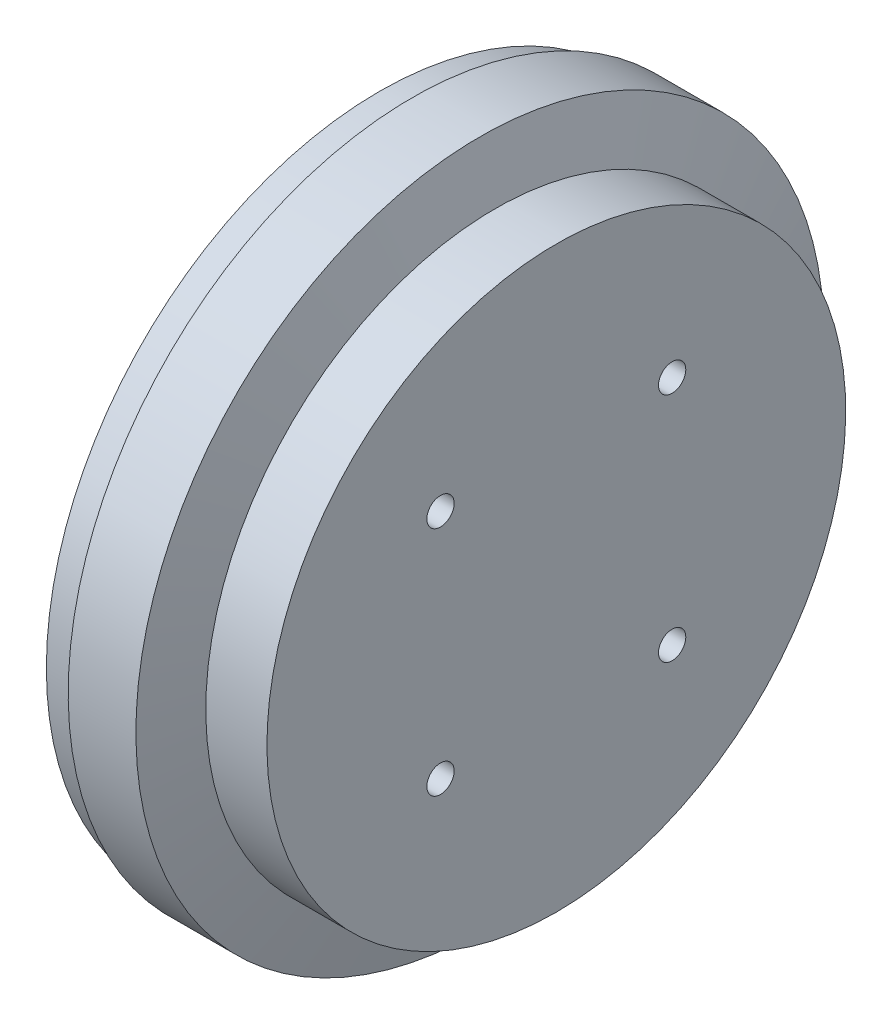
ISO-10303-21;
HEADER;
FILE_DESCRIPTION(('STEP AP214'),'2;1');
FILE_NAME('part.step','',(''),(''),'','','');
FILE_SCHEMA(('AUTOMOTIVE_DESIGN { 1 0 10303 214 1 1 1 1 }'));
ENDSEC;
DATA;
#1=APPLICATION_CONTEXT('core data for automotive mechanical design processes');
#2=APPLICATION_PROTOCOL_DEFINITION('international standard','automotive_design',2000,#1);
#3=PRODUCT_CONTEXT('',#1,'mechanical');
#4=PRODUCT('Part','Part','',(#3));
#5=PRODUCT_RELATED_PRODUCT_CATEGORY('part','',(#4));
#6=PRODUCT_DEFINITION_FORMATION('','',#4);
#7=PRODUCT_DEFINITION_CONTEXT('part definition',#1,'design');
#8=PRODUCT_DEFINITION('design','',#6,#7);
#9=PRODUCT_DEFINITION_SHAPE('','',#8);
#10=(LENGTH_UNIT() NAMED_UNIT(*) SI_UNIT(.MILLI.,.METRE.));
#11=(NAMED_UNIT(*) PLANE_ANGLE_UNIT() SI_UNIT($,.RADIAN.));
#12=(NAMED_UNIT(*) SI_UNIT($,.STERADIAN.) SOLID_ANGLE_UNIT());
#13=UNCERTAINTY_MEASURE_WITH_UNIT(LENGTH_MEASURE(1.E-05),#10,'distance_accuracy_value','');
#14=(GEOMETRIC_REPRESENTATION_CONTEXT(3) GLOBAL_UNCERTAINTY_ASSIGNED_CONTEXT((#13)) GLOBAL_UNIT_ASSIGNED_CONTEXT((#10,
#11,#12)) REPRESENTATION_CONTEXT('',''));
#15=CARTESIAN_POINT('',(0.,0.,0.));
#16=DIRECTION('',(0.,0.,1.));
#17=DIRECTION('',(1.,0.,0.));
#18=AXIS2_PLACEMENT_3D('',#15,#16,#17);
#19=CARTESIAN_POINT('',(-6.59999999999999,0.,0.));
#20=DIRECTION('',(-1.,0.,0.));
#21=DIRECTION('',(0.,-1.,0.));
#22=AXIS2_PLACEMENT_3D('',#19,#20,#21);
#23=CYLINDRICAL_SURFACE('',#22,26.5);
#24=CARTESIAN_POINT('',(1.,0.,0.));
#25=DIRECTION('',(-1.,0.,0.));
#26=DIRECTION('',(0.,-1.,0.));
#27=AXIS2_PLACEMENT_3D('',#24,#25,#26);
#28=CIRCLE('',#27,26.5);
#29=CARTESIAN_POINT('',(1.,-26.5,0.));
#30=VERTEX_POINT('',#29);
#31=EDGE_CURVE('E39',#30,#30,#28,.T.);
#32=ORIENTED_EDGE('',*,*,#31,.F.);
#33=EDGE_LOOP('',(#32));
#34=FACE_BOUND('',#33,.T.);
#35=CARTESIAN_POINT('',(6.59999999999999,0.,0.));
#36=DIRECTION('',(-1.,0.,0.));
#37=DIRECTION('',(0.,-1.,0.));
#38=AXIS2_PLACEMENT_3D('',#35,#36,#37);
#39=CIRCLE('',#38,26.5);
#40=CARTESIAN_POINT('',(6.59999999999999,-26.5,0.));
#41=VERTEX_POINT('',#40);
#42=EDGE_CURVE('E91',#41,#41,#39,.T.);
#43=ORIENTED_EDGE('',*,*,#42,.T.);
#44=EDGE_LOOP('',(#43));
#45=FACE_BOUND('',#44,.T.);
#46=ADVANCED_FACE('F36',(#34,#45),#23,.T.);
#47=CARTESIAN_POINT('',(1.,0.,0.));
#48=DIRECTION('',(-1.,0.,0.));
#49=DIRECTION('',(0.,-1.,0.));
#50=AXIS2_PLACEMENT_3D('',#47,#48,#49);
#51=CONICAL_SURFACE('',#50,26.5,1.29778762370819);
#52=CARTESIAN_POINT('',(-0.399999999999991,0.,0.));
#53=DIRECTION('',(-1.,0.,0.));
#54=DIRECTION('',(0.,-1.,0.));
#55=AXIS2_PLACEMENT_3D('',#52,#53,#54);
#56=CIRCLE('',#55,31.5);
#57=CARTESIAN_POINT('',(-0.399999999999991,-31.5,0.));
#58=VERTEX_POINT('',#57);
#59=EDGE_CURVE('E96',#58,#58,#56,.T.);
#60=ORIENTED_EDGE('',*,*,#59,.F.);
#61=EDGE_LOOP('',(#60));
#62=FACE_BOUND('',#61,.T.);
#63=ORIENTED_EDGE('',*,*,#31,.T.);
#64=EDGE_LOOP('',(#63));
#65=FACE_BOUND('',#64,.T.);
#66=ADVANCED_FACE('F103',(#62,#65),#51,.T.);
#67=CARTESIAN_POINT('',(-6.59999999999999,0.,0.));
#68=DIRECTION('',(-1.,0.,0.));
#69=DIRECTION('',(0.,-1.,0.));
#70=AXIS2_PLACEMENT_3D('',#67,#68,#69);
#71=CYLINDRICAL_SURFACE('',#70,31.5);
#72=CARTESIAN_POINT('',(-6.59999999999999,0.,0.));
#73=DIRECTION('',(-1.,0.,0.));
#74=DIRECTION('',(0.,-1.,0.));
#75=AXIS2_PLACEMENT_3D('',#72,#73,#74);
#76=CIRCLE('',#75,31.5);
#77=CARTESIAN_POINT('',(-6.59999999999999,-31.5,0.));
#78=VERTEX_POINT('',#77);
#79=EDGE_CURVE('E94',#78,#78,#76,.T.);
#80=ORIENTED_EDGE('',*,*,#79,.F.);
#81=EDGE_LOOP('',(#80));
#82=FACE_BOUND('',#81,.T.);
#83=ORIENTED_EDGE('',*,*,#59,.T.);
#84=EDGE_LOOP('',(#83));
#85=FACE_BOUND('',#84,.T.);
#86=ADVANCED_FACE('F122',(#82,#85),#71,.T.);
#87=CARTESIAN_POINT('',(-6.59999999999999,31.5,0.));
#88=DIRECTION('',(1.,0.,0.));
#89=DIRECTION('',(0.,1.,0.));
#90=AXIS2_PLACEMENT_3D('',#87,#88,#89);
#91=PLANE('',#90);
#92=CARTESIAN_POINT('',(-6.59999999999999,0.,0.));
#93=DIRECTION('',(-1.,0.,0.));
#94=DIRECTION('',(0.,-1.,0.));
#95=AXIS2_PLACEMENT_3D('',#92,#93,#94);
#96=CIRCLE('',#95,30.5);
#97=CARTESIAN_POINT('',(-6.59999999999999,-30.5,0.));
#98=VERTEX_POINT('',#97);
#99=EDGE_CURVE('E11',#98,#98,#96,.T.);
#100=ORIENTED_EDGE('',*,*,#99,.F.);
#101=EDGE_LOOP('',(#100));
#102=FACE_BOUND('',#101,.T.);
#103=ORIENTED_EDGE('',*,*,#79,.T.);
#104=EDGE_LOOP('',(#103));
#105=FACE_BOUND('',#104,.T.);
#106=ADVANCED_FACE('F112',(#102,#105),#91,.F.);
#107=CARTESIAN_POINT('',(6.59999999999998,0.,0.));
#108=DIRECTION('',(-1.,0.,0.));
#109=DIRECTION('',(0.,-1.,0.));
#110=AXIS2_PLACEMENT_3D('',#107,#108,#109);
#111=PLANE('',#110);
#112=CARTESIAN_POINT('',(6.59999999999999,10.6066017177982,10.6066017177982));
#113=DIRECTION('',(1.,0.,0.));
#114=DIRECTION('',(0.,0.,-1.));
#115=AXIS2_PLACEMENT_3D('',#112,#113,#114);
#116=CIRCLE('',#115,1.24999999999999);
#117=CARTESIAN_POINT('',(6.59999999999999,10.6066017177982,9.35660171779821));
#118=VERTEX_POINT('',#117);
#119=EDGE_CURVE('E68',#118,#118,#116,.T.);
#120=ORIENTED_EDGE('',*,*,#119,.F.);
#121=EDGE_LOOP('',(#120));
#122=FACE_BOUND('',#121,.T.);
#123=CARTESIAN_POINT('',(6.59999999999999,-10.6066017177982,10.6066017177982));
#124=DIRECTION('',(1.,0.,0.));
#125=DIRECTION('',(0.,0.,-1.));
#126=AXIS2_PLACEMENT_3D('',#123,#124,#125);
#127=CIRCLE('',#126,1.24999999999999);
#128=CARTESIAN_POINT('',(6.59999999999999,-10.6066017177982,9.3566017177982));
#129=VERTEX_POINT('',#128);
#130=EDGE_CURVE('E67',#129,#129,#127,.T.);
#131=ORIENTED_EDGE('',*,*,#130,.F.);
#132=EDGE_LOOP('',(#131));
#133=FACE_BOUND('',#132,.T.);
#134=CARTESIAN_POINT('',(6.59999999999999,-10.6066017177982,-10.6066017177982));
#135=DIRECTION('',(1.,0.,0.));
#136=DIRECTION('',(0.,0.,-1.));
#137=AXIS2_PLACEMENT_3D('',#134,#135,#136);
#138=CIRCLE('',#137,1.24999999999999);
#139=CARTESIAN_POINT('',(6.59999999999999,-10.6066017177982,-11.8566017177982));
#140=VERTEX_POINT('',#139);
#141=EDGE_CURVE('E79',#140,#140,#138,.T.);
#142=ORIENTED_EDGE('',*,*,#141,.F.);
#143=EDGE_LOOP('',(#142));
#144=FACE_BOUND('',#143,.T.);
#145=CARTESIAN_POINT('',(6.59999999999999,10.6066017177982,-10.6066017177982));
#146=DIRECTION('',(1.,0.,0.));
#147=DIRECTION('',(0.,0.,-1.));
#148=AXIS2_PLACEMENT_3D('',#145,#146,#147);
#149=CIRCLE('',#148,1.24999999999999);
#150=CARTESIAN_POINT('',(6.59999999999999,10.6066017177982,-11.8566017177982));
#151=VERTEX_POINT('',#150);
#152=EDGE_CURVE('E85',#151,#151,#149,.T.);
#153=ORIENTED_EDGE('',*,*,#152,.F.);
#154=EDGE_LOOP('',(#153));
#155=FACE_BOUND('',#154,.T.);
#156=ORIENTED_EDGE('',*,*,#42,.F.);
#157=EDGE_LOOP('',(#156));
#158=FACE_BOUND('',#157,.T.);
#159=ADVANCED_FACE('F109',(#122,#133,#144,#155,#158),#111,.F.);
#160=CARTESIAN_POINT('',(-0.900000000000008,10.6066017177982,-10.6066017177982));
#161=DIRECTION('',(1.,0.,0.));
#162=DIRECTION('',(0.,0.,-1.));
#163=AXIS2_PLACEMENT_3D('',#160,#161,#162);
#164=CONICAL_SURFACE('',#163,1.24999999999999,1.02974425867664);
#165=CARTESIAN_POINT('',(-1.65107577378447,10.6066017177982,-10.6066017177982));
#166=VERTEX_POINT('',#165);
#167=VERTEX_LOOP('',#166);
#168=FACE_BOUND('',#167,.T.);
#169=CARTESIAN_POINT('',(-0.900000000000008,10.6066017177982,-10.6066017177982));
#170=DIRECTION('',(1.,0.,0.));
#171=DIRECTION('',(0.,0.,-1.));
#172=AXIS2_PLACEMENT_3D('',#169,#170,#171);
#173=CIRCLE('',#172,1.24999999999999);
#174=CARTESIAN_POINT('',(-0.900000000000008,10.6066017177982,-11.8566017177982));
#175=VERTEX_POINT('',#174);
#176=EDGE_CURVE('E88',#175,#175,#173,.T.);
#177=ORIENTED_EDGE('',*,*,#176,.T.);
#178=EDGE_LOOP('',(#177));
#179=FACE_BOUND('',#178,.T.);
#180=ADVANCED_FACE('F111',(#168,#179),#164,.F.);
#181=CARTESIAN_POINT('',(6.59999999999998,10.6066017177982,-10.6066017177982));
#182=DIRECTION('',(1.,0.,0.));
#183=DIRECTION('',(0.,0.,-1.));
#184=AXIS2_PLACEMENT_3D('',#181,#182,#183);
#185=CYLINDRICAL_SURFACE('',#184,1.24999999999999);
#186=ORIENTED_EDGE('',*,*,#176,.F.);
#187=EDGE_LOOP('',(#186));
#188=FACE_BOUND('',#187,.T.);
#189=ORIENTED_EDGE('',*,*,#152,.T.);
#190=EDGE_LOOP('',(#189));
#191=FACE_BOUND('',#190,.T.);
#192=ADVANCED_FACE('F119',(#188,#191),#185,.F.);
#193=CARTESIAN_POINT('',(-0.900000000000008,-10.6066017177982,-10.6066017177982));
#194=DIRECTION('',(1.,0.,0.));
#195=DIRECTION('',(0.,0.,-1.));
#196=AXIS2_PLACEMENT_3D('',#193,#194,#195);
#197=CONICAL_SURFACE('',#196,1.24999999999999,1.02974425867664);
#198=CARTESIAN_POINT('',(-1.65107577378447,-10.6066017177982,-10.6066017177982));
#199=VERTEX_POINT('',#198);
#200=VERTEX_LOOP('',#199);
#201=FACE_BOUND('',#200,.T.);
#202=CARTESIAN_POINT('',(-0.900000000000008,-10.6066017177982,-10.6066017177982));
#203=DIRECTION('',(1.,0.,0.));
#204=DIRECTION('',(0.,0.,-1.));
#205=AXIS2_PLACEMENT_3D('',#202,#203,#204);
#206=CIRCLE('',#205,1.24999999999999);
#207=CARTESIAN_POINT('',(-0.900000000000008,-10.6066017177982,-11.8566017177982));
#208=VERTEX_POINT('',#207);
#209=EDGE_CURVE('E82',#208,#208,#206,.T.);
#210=ORIENTED_EDGE('',*,*,#209,.T.);
#211=EDGE_LOOP('',(#210));
#212=FACE_BOUND('',#211,.T.);
#213=ADVANCED_FACE('F188',(#201,#212),#197,.F.);
#214=CARTESIAN_POINT('',(6.59999999999998,-10.6066017177982,-10.6066017177982));
#215=DIRECTION('',(1.,0.,0.));
#216=DIRECTION('',(0.,0.,-1.));
#217=AXIS2_PLACEMENT_3D('',#214,#215,#216);
#218=CYLINDRICAL_SURFACE('',#217,1.24999999999999);
#219=ORIENTED_EDGE('',*,*,#209,.F.);
#220=EDGE_LOOP('',(#219));
#221=FACE_BOUND('',#220,.T.);
#222=ORIENTED_EDGE('',*,*,#141,.T.);
#223=EDGE_LOOP('',(#222));
#224=FACE_BOUND('',#223,.T.);
#225=ADVANCED_FACE('F184',(#221,#224),#218,.F.);
#226=CARTESIAN_POINT('',(-0.900000000000008,-10.6066017177982,10.6066017177982));
#227=DIRECTION('',(1.,0.,0.));
#228=DIRECTION('',(0.,0.,-1.));
#229=AXIS2_PLACEMENT_3D('',#226,#227,#228);
#230=CONICAL_SURFACE('',#229,1.24999999999999,1.02974425867664);
#231=CARTESIAN_POINT('',(-1.65107577378447,-10.6066017177982,10.6066017177982));
#232=VERTEX_POINT('',#231);
#233=VERTEX_LOOP('',#232);
#234=FACE_BOUND('',#233,.T.);
#235=CARTESIAN_POINT('',(-0.900000000000008,-10.6066017177982,10.6066017177982));
#236=DIRECTION('',(1.,0.,0.));
#237=DIRECTION('',(0.,0.,-1.));
#238=AXIS2_PLACEMENT_3D('',#235,#236,#237);
#239=CIRCLE('',#238,1.24999999999999);
#240=CARTESIAN_POINT('',(-0.900000000000008,-10.6066017177982,9.35660171779821));
#241=VERTEX_POINT('',#240);
#242=EDGE_CURVE('E71',#241,#241,#239,.T.);
#243=ORIENTED_EDGE('',*,*,#242,.T.);
#244=EDGE_LOOP('',(#243));
#245=FACE_BOUND('',#244,.T.);
#246=ADVANCED_FACE('F180',(#234,#245),#230,.F.);
#247=CARTESIAN_POINT('',(6.59999999999998,-10.6066017177982,10.6066017177982));
#248=DIRECTION('',(1.,0.,0.));
#249=DIRECTION('',(0.,0.,-1.));
#250=AXIS2_PLACEMENT_3D('',#247,#248,#249);
#251=CYLINDRICAL_SURFACE('',#250,1.24999999999999);
#252=ORIENTED_EDGE('',*,*,#242,.F.);
#253=EDGE_LOOP('',(#252));
#254=FACE_BOUND('',#253,.T.);
#255=ORIENTED_EDGE('',*,*,#130,.T.);
#256=EDGE_LOOP('',(#255));
#257=FACE_BOUND('',#256,.T.);
#258=ADVANCED_FACE('F61',(#254,#257),#251,.F.);
#259=CARTESIAN_POINT('',(-0.900000000000008,10.6066017177982,10.6066017177982));
#260=DIRECTION('',(1.,0.,0.));
#261=DIRECTION('',(0.,0.,-1.));
#262=AXIS2_PLACEMENT_3D('',#259,#260,#261);
#263=CONICAL_SURFACE('',#262,1.24999999999999,1.02974425867664);
#264=CARTESIAN_POINT('',(-1.65107577378447,10.6066017177982,10.6066017177982));
#265=VERTEX_POINT('',#264);
#266=VERTEX_LOOP('',#265);
#267=FACE_BOUND('',#266,.T.);
#268=CARTESIAN_POINT('',(-0.900000000000008,10.6066017177982,10.6066017177982));
#269=DIRECTION('',(1.,0.,0.));
#270=DIRECTION('',(0.,0.,-1.));
#271=AXIS2_PLACEMENT_3D('',#268,#269,#270);
#272=CIRCLE('',#271,1.24999999999999);
#273=CARTESIAN_POINT('',(-0.900000000000008,10.6066017177982,9.35660171779821));
#274=VERTEX_POINT('',#273);
#275=EDGE_CURVE('E65',#274,#274,#272,.T.);
#276=ORIENTED_EDGE('',*,*,#275,.T.);
#277=EDGE_LOOP('',(#276));
#278=FACE_BOUND('',#277,.T.);
#279=ADVANCED_FACE('F57',(#267,#278),#263,.F.);
#280=CARTESIAN_POINT('',(6.59999999999998,10.6066017177982,10.6066017177982));
#281=DIRECTION('',(1.,0.,0.));
#282=DIRECTION('',(0.,0.,-1.));
#283=AXIS2_PLACEMENT_3D('',#280,#281,#282);
#284=CYLINDRICAL_SURFACE('',#283,1.24999999999999);
#285=ORIENTED_EDGE('',*,*,#275,.F.);
#286=EDGE_LOOP('',(#285));
#287=FACE_BOUND('',#286,.T.);
#288=ORIENTED_EDGE('',*,*,#119,.T.);
#289=EDGE_LOOP('',(#288));
#290=FACE_BOUND('',#289,.T.);
#291=ADVANCED_FACE('F60',(#287,#290),#284,.F.);
#292=CARTESIAN_POINT('',(-9.59999999999999,0.,0.));
#293=DIRECTION('',(1.,0.,0.));
#294=DIRECTION('',(0.,1.,0.));
#295=AXIS2_PLACEMENT_3D('',#292,#293,#294);
#296=CYLINDRICAL_SURFACE('',#295,30.5);
#297=CARTESIAN_POINT('',(-9.59999999999999,0.,0.));
#298=DIRECTION('',(-1.,0.,0.));
#299=DIRECTION('',(0.,-1.,0.));
#300=AXIS2_PLACEMENT_3D('',#297,#298,#299);
#301=CIRCLE('',#300,30.5);
#302=CARTESIAN_POINT('',(-9.59999999999999,-30.5,0.));
#303=VERTEX_POINT('',#302);
#304=EDGE_CURVE('E74',#303,#303,#301,.T.);
#305=ORIENTED_EDGE('',*,*,#304,.F.);
#306=EDGE_LOOP('',(#305));
#307=FACE_BOUND('',#306,.T.);
#308=ORIENTED_EDGE('',*,*,#99,.T.);
#309=EDGE_LOOP('',(#308));
#310=FACE_BOUND('',#309,.T.);
#311=ADVANCED_FACE('F155',(#307,#310),#296,.T.);
#312=CARTESIAN_POINT('',(-9.59999999999999,0.,0.));
#313=DIRECTION('',(-1.,0.,0.));
#314=DIRECTION('',(0.,-1.,0.));
#315=AXIS2_PLACEMENT_3D('',#312,#313,#314);
#316=PLANE('',#315);
#317=ORIENTED_EDGE('',*,*,#304,.T.);
#318=EDGE_LOOP('',(#317));
#319=FACE_BOUND('',#318,.T.);
#320=ADVANCED_FACE('F160',(#319),#316,.T.);
#321=CLOSED_SHELL('',(#46,#66,#86,#106,#159,#180,#192,#213,#225,#246,#258,#279,#291,#311,#320));
#322=MANIFOLD_SOLID_BREP('B2',#321);
#323=ADVANCED_BREP_SHAPE_REPRESENTATION('',(#18,#322),#14);
#324=SHAPE_DEFINITION_REPRESENTATION(#9,#323);
ENDSEC;
END-ISO-10303-21;
